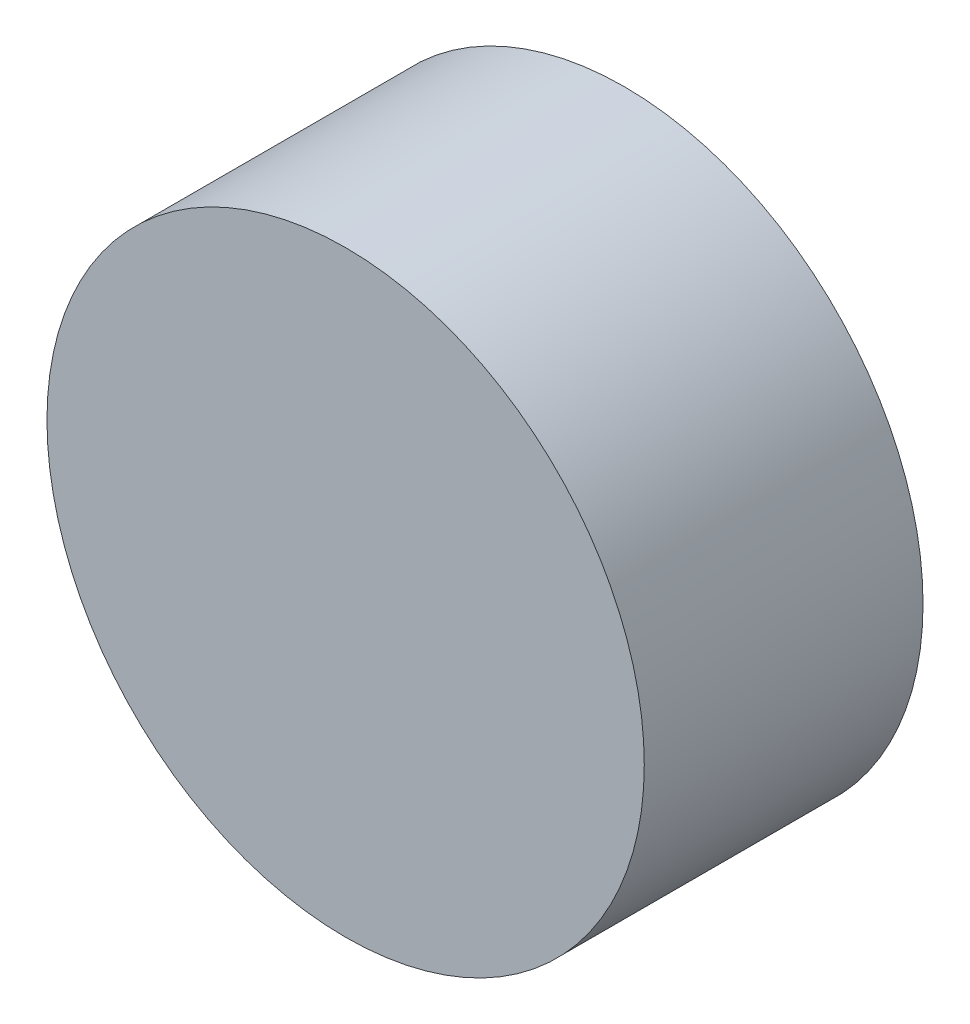
ISO-10303-21;
HEADER;
FILE_DESCRIPTION(('STEP AP214'),'2;1');
FILE_NAME('part.step','',(''),(''),'','','');
FILE_SCHEMA(('AUTOMOTIVE_DESIGN { 1 0 10303 214 1 1 1 1 }'));
ENDSEC;
DATA;
#1=APPLICATION_CONTEXT('core data for automotive mechanical design processes');
#2=APPLICATION_PROTOCOL_DEFINITION('international standard','automotive_design',2000,#1);
#3=PRODUCT_CONTEXT('',#1,'mechanical');
#4=PRODUCT('Part','Part','',(#3));
#5=PRODUCT_RELATED_PRODUCT_CATEGORY('part','',(#4));
#6=PRODUCT_DEFINITION_FORMATION('','',#4);
#7=PRODUCT_DEFINITION_CONTEXT('part definition',#1,'design');
#8=PRODUCT_DEFINITION('design','',#6,#7);
#9=PRODUCT_DEFINITION_SHAPE('','',#8);
#10=(LENGTH_UNIT() NAMED_UNIT(*) SI_UNIT(.MILLI.,.METRE.));
#11=(NAMED_UNIT(*) PLANE_ANGLE_UNIT() SI_UNIT($,.RADIAN.));
#12=(NAMED_UNIT(*) SI_UNIT($,.STERADIAN.) SOLID_ANGLE_UNIT());
#13=UNCERTAINTY_MEASURE_WITH_UNIT(LENGTH_MEASURE(1.E-05),#10,'distance_accuracy_value','');
#14=(GEOMETRIC_REPRESENTATION_CONTEXT(3) GLOBAL_UNCERTAINTY_ASSIGNED_CONTEXT((#13)) GLOBAL_UNIT_ASSIGNED_CONTEXT((#10,
#11,#12)) REPRESENTATION_CONTEXT('',''));
#15=CARTESIAN_POINT('',(0.,0.,0.));
#16=DIRECTION('',(0.,0.,1.));
#17=DIRECTION('',(1.,0.,0.));
#18=AXIS2_PLACEMENT_3D('',#15,#16,#17);
#19=CARTESIAN_POINT('',(0.,0.,28.));
#20=DIRECTION('',(0.,0.,-1.));
#21=DIRECTION('',(-1.,0.,0.));
#22=AXIS2_PLACEMENT_3D('',#19,#20,#21);
#23=CYLINDRICAL_SURFACE('',#22,30.);
#24=CARTESIAN_POINT('',(0.,0.,28.));
#25=DIRECTION('',(0.,0.,1.));
#26=DIRECTION('',(1.,0.,0.));
#27=AXIS2_PLACEMENT_3D('',#24,#25,#26);
#28=CIRCLE('',#27,30.);
#29=CARTESIAN_POINT('',(30.,0.,28.));
#30=VERTEX_POINT('',#29);
#31=EDGE_CURVE('E10',#30,#30,#28,.T.);
#32=ORIENTED_EDGE('',*,*,#31,.F.);
#33=EDGE_LOOP('',(#32));
#34=FACE_BOUND('',#33,.T.);
#35=CARTESIAN_POINT('',(0.,0.,0.));
#36=DIRECTION('',(0.,0.,1.));
#37=DIRECTION('',(1.,0.,0.));
#38=AXIS2_PLACEMENT_3D('',#35,#36,#37);
#39=CIRCLE('',#38,30.);
#40=CARTESIAN_POINT('',(30.,0.,0.));
#41=VERTEX_POINT('',#40);
#42=EDGE_CURVE('E46',#41,#41,#39,.T.);
#43=ORIENTED_EDGE('',*,*,#42,.T.);
#44=EDGE_LOOP('',(#43));
#45=FACE_BOUND('',#44,.T.);
#46=ADVANCED_FACE('F43',(#34,#45),#23,.T.);
#47=CARTESIAN_POINT('',(0.,0.,28.));
#48=DIRECTION('',(0.,0.,1.));
#49=DIRECTION('',(1.,0.,0.));
#50=AXIS2_PLACEMENT_3D('',#47,#48,#49);
#51=PLANE('',#50);
#52=ORIENTED_EDGE('',*,*,#31,.T.);
#53=EDGE_LOOP('',(#52));
#54=FACE_BOUND('',#53,.T.);
#55=ADVANCED_FACE('F58',(#54),#51,.T.);
#56=CARTESIAN_POINT('',(0.,0.,0.));
#57=DIRECTION('',(0.,0.,1.));
#58=DIRECTION('',(1.,0.,0.));
#59=AXIS2_PLACEMENT_3D('',#56,#57,#58);
#60=PLANE('',#59);
#61=ORIENTED_EDGE('',*,*,#42,.F.);
#62=EDGE_LOOP('',(#61));
#63=FACE_BOUND('',#62,.T.);
#64=ADVANCED_FACE('F59',(#63),#60,.F.);
#65=CLOSED_SHELL('',(#46,#55,#64));
#66=MANIFOLD_SOLID_BREP('B2',#65);
#67=ADVANCED_BREP_SHAPE_REPRESENTATION('',(#18,#66),#14);
#68=SHAPE_DEFINITION_REPRESENTATION(#9,#67);
ENDSEC;
END-ISO-10303-21;
